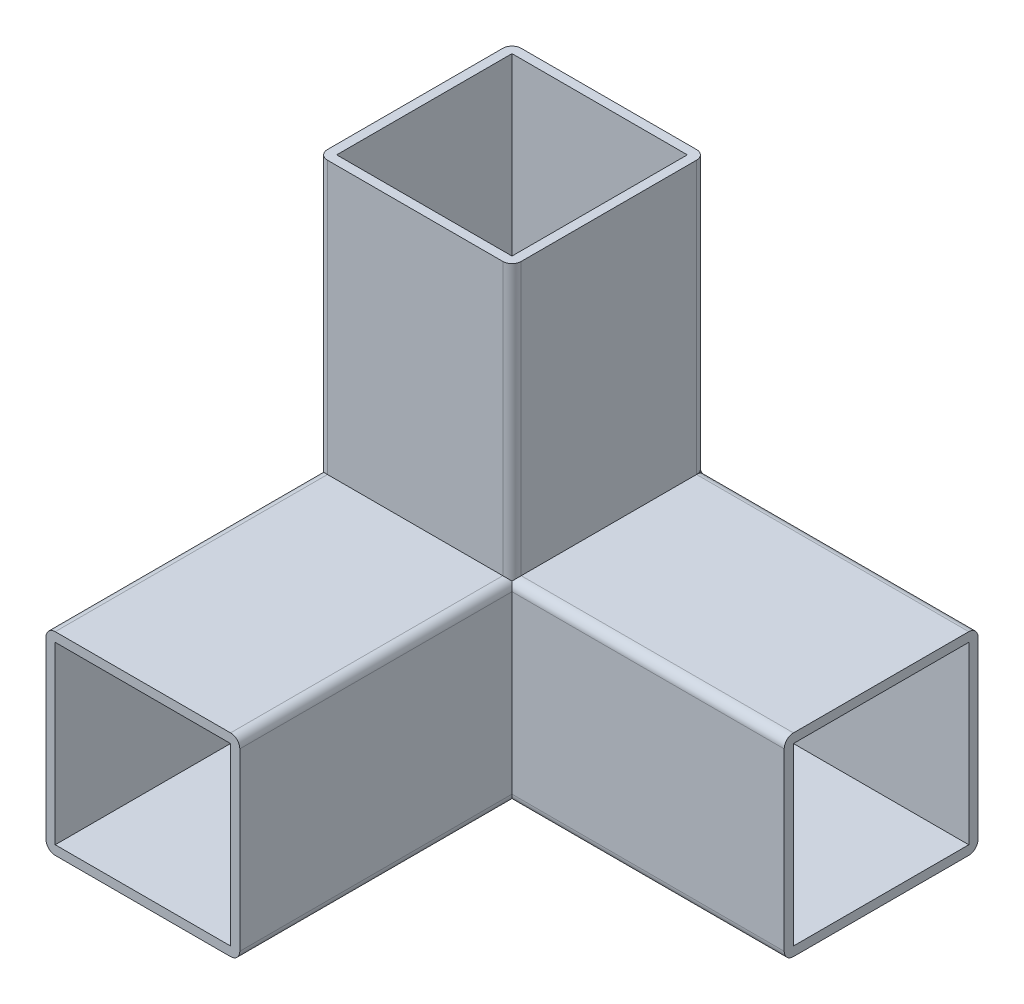
ISO-10303-21;
HEADER;
FILE_DESCRIPTION(('STEP AP214'),'2;1');
FILE_NAME('part.step','',(''),(''),'','','');
FILE_SCHEMA(('AUTOMOTIVE_DESIGN { 1 0 10303 214 1 1 1 1 }'));
ENDSEC;
DATA;
#1=APPLICATION_CONTEXT('core data for automotive mechanical design processes');
#2=APPLICATION_PROTOCOL_DEFINITION('international standard','automotive_design',2000,#1);
#3=PRODUCT_CONTEXT('',#1,'mechanical');
#4=PRODUCT('Part','Part','',(#3));
#5=PRODUCT_RELATED_PRODUCT_CATEGORY('part','',(#4));
#6=PRODUCT_DEFINITION_FORMATION('','',#4);
#7=PRODUCT_DEFINITION_CONTEXT('part definition',#1,'design');
#8=PRODUCT_DEFINITION('design','',#6,#7);
#9=PRODUCT_DEFINITION_SHAPE('','',#8);
#10=(LENGTH_UNIT() NAMED_UNIT(*) SI_UNIT(.MILLI.,.METRE.));
#11=(NAMED_UNIT(*) PLANE_ANGLE_UNIT() SI_UNIT($,.RADIAN.));
#12=(NAMED_UNIT(*) SI_UNIT($,.STERADIAN.) SOLID_ANGLE_UNIT());
#13=UNCERTAINTY_MEASURE_WITH_UNIT(LENGTH_MEASURE(1.E-05),#10,'distance_accuracy_value','');
#14=(GEOMETRIC_REPRESENTATION_CONTEXT(3) GLOBAL_UNCERTAINTY_ASSIGNED_CONTEXT((#13)) GLOBAL_UNIT_ASSIGNED_CONTEXT((#10,
#11,#12)) REPRESENTATION_CONTEXT('',''));
#15=CARTESIAN_POINT('',(0.,0.,0.));
#16=DIRECTION('',(0.,0.,1.));
#17=DIRECTION('',(1.,0.,0.));
#18=AXIS2_PLACEMENT_3D('',#15,#16,#17);
#19=CARTESIAN_POINT('',(-29.437,26.67,26.67));
#20=DIRECTION('',(0.,1.,0.));
#21=DIRECTION('',(0.,0.,1.));
#22=AXIS2_PLACEMENT_3D('',#19,#20,#21);
#23=PLANE('',#22);
#24=DIRECTION('',(-1.,0.,0.));
#25=VECTOR('',#24,1.);
#26=CARTESIAN_POINT('',(-26.67,26.67,26.67));
#27=LINE('',#26,#25);
#28=CARTESIAN_POINT('',(24.13,26.67,26.67));
#29=VERTEX_POINT('',#28);
#30=CARTESIAN_POINT('',(-24.13,26.67,26.67));
#31=VERTEX_POINT('',#30);
#32=EDGE_CURVE('E355',#29,#31,#27,.T.);
#33=ORIENTED_EDGE('',*,*,#32,.T.);
#34=DIRECTION('',(0.,0.,1.));
#35=VECTOR('',#34,1.);
#36=CARTESIAN_POINT('',(-24.13,26.67,26.67));
#37=LINE('',#36,#35);
#38=CARTESIAN_POINT('',(-24.13,26.67,101.6));
#39=VERTEX_POINT('',#38);
#40=EDGE_CURVE('E511',#31,#39,#37,.T.);
#41=ORIENTED_EDGE('',*,*,#40,.T.);
#42=DIRECTION('',(-1.,0.,0.));
#43=VECTOR('',#42,1.);
#44=CARTESIAN_POINT('',(-26.67,26.67,101.6));
#45=LINE('',#44,#43);
#46=CARTESIAN_POINT('',(24.13,26.67,101.6));
#47=VERTEX_POINT('',#46);
#48=EDGE_CURVE('E335',#47,#39,#45,.T.);
#49=ORIENTED_EDGE('',*,*,#48,.F.);
#50=DIRECTION('',(0.,0.,1.));
#51=VECTOR('',#50,1.);
#52=CARTESIAN_POINT('',(24.13,26.67,26.67));
#53=LINE('',#52,#51);
#54=EDGE_CURVE('E508',#47,#29,#53,.F.);
#55=ORIENTED_EDGE('',*,*,#54,.T.);
#56=EDGE_LOOP('',(#33,#41,#49,#55));
#57=FACE_BOUND('',#56,.T.);
#58=ADVANCED_FACE('F48',(#57),#23,.T.);
#59=CARTESIAN_POINT('',(101.6,0.,0.));
#60=DIRECTION('',(-1.,0.,0.));
#61=DIRECTION('',(0.,0.,1.));
#62=AXIS2_PLACEMENT_3D('',#59,#60,#61);
#63=PLANE('',#62);
#64=DIRECTION('',(0.,0.,1.));
#65=VECTOR('',#64,1.);
#66=CARTESIAN_POINT('',(101.6,26.67,26.67));
#67=LINE('',#66,#65);
#68=CARTESIAN_POINT('',(101.6,26.67,-24.13));
#69=VERTEX_POINT('',#68);
#70=CARTESIAN_POINT('',(101.6,26.67,24.13));
#71=VERTEX_POINT('',#70);
#72=EDGE_CURVE('E381',#69,#71,#67,.T.);
#73=ORIENTED_EDGE('',*,*,#72,.T.);
#74=CARTESIAN_POINT('',(101.6,24.13,24.13));
#75=DIRECTION('',(-1.,0.,0.));
#76=DIRECTION('',(0.,0.,1.));
#77=AXIS2_PLACEMENT_3D('',#74,#75,#76);
#78=CIRCLE('',#77,2.54);
#79=CARTESIAN_POINT('',(101.6,24.13,26.67));
#80=VERTEX_POINT('',#79);
#81=EDGE_CURVE('E72',#71,#80,#78,.F.);
#82=ORIENTED_EDGE('',*,*,#81,.T.);
#83=DIRECTION('',(0.,-1.,0.));
#84=VECTOR('',#83,1.);
#85=CARTESIAN_POINT('',(101.6,-26.67,26.67));
#86=LINE('',#85,#84);
#87=CARTESIAN_POINT('',(101.6,-24.13,26.67));
#88=VERTEX_POINT('',#87);
#89=EDGE_CURVE('E378',#80,#88,#86,.T.);
#90=ORIENTED_EDGE('',*,*,#89,.T.);
#91=CARTESIAN_POINT('',(101.6,-24.13,24.13));
#92=DIRECTION('',(-1.,0.,0.));
#93=DIRECTION('',(0.,0.,1.));
#94=AXIS2_PLACEMENT_3D('',#91,#92,#93);
#95=CIRCLE('',#94,2.54);
#96=CARTESIAN_POINT('',(101.6,-26.67,24.13));
#97=VERTEX_POINT('',#96);
#98=EDGE_CURVE('E434',#88,#97,#95,.F.);
#99=ORIENTED_EDGE('',*,*,#98,.T.);
#100=DIRECTION('',(0.,0.,-1.));
#101=VECTOR('',#100,1.);
#102=CARTESIAN_POINT('',(101.6,-26.67,26.67));
#103=LINE('',#102,#101);
#104=CARTESIAN_POINT('',(101.6,-26.67,-24.13));
#105=VERTEX_POINT('',#104);
#106=EDGE_CURVE('E350',#97,#105,#103,.T.);
#107=ORIENTED_EDGE('',*,*,#106,.T.);
#108=CARTESIAN_POINT('',(101.6,-24.13,-24.13));
#109=DIRECTION('',(-1.,0.,0.));
#110=DIRECTION('',(0.,0.,1.));
#111=AXIS2_PLACEMENT_3D('',#108,#109,#110);
#112=CIRCLE('',#111,2.54);
#113=CARTESIAN_POINT('',(101.6,-24.13,-26.67));
#114=VERTEX_POINT('',#113);
#115=EDGE_CURVE('E428',#105,#114,#112,.F.);
#116=ORIENTED_EDGE('',*,*,#115,.T.);
#117=DIRECTION('',(0.,1.,0.));
#118=VECTOR('',#117,1.);
#119=CARTESIAN_POINT('',(101.6,-26.67,-26.67));
#120=LINE('',#119,#118);
#121=CARTESIAN_POINT('',(101.6,24.13,-26.67));
#122=VERTEX_POINT('',#121);
#123=EDGE_CURVE('E362',#114,#122,#120,.T.);
#124=ORIENTED_EDGE('',*,*,#123,.T.);
#125=CARTESIAN_POINT('',(101.6,24.13,-24.13));
#126=DIRECTION('',(-1.,0.,0.));
#127=DIRECTION('',(0.,0.,1.));
#128=AXIS2_PLACEMENT_3D('',#125,#126,#127);
#129=CIRCLE('',#128,2.54);
#130=EDGE_CURVE('E431',#122,#69,#129,.F.);
#131=ORIENTED_EDGE('',*,*,#130,.T.);
#132=EDGE_LOOP('',(#73,#82,#90,#99,#107,#116,#124,#131));
#133=FACE_BOUND('',#132,.T.);
#134=DIRECTION('',(0.,1.,0.));
#135=VECTOR('',#134,1.);
#136=CARTESIAN_POINT('',(101.6,-26.67,-24.13));
#137=LINE('',#136,#135);
#138=CARTESIAN_POINT('',(101.6,-24.13,-24.13));
#139=VERTEX_POINT('',#138);
#140=CARTESIAN_POINT('',(101.6,24.13,-24.13));
#141=VERTEX_POINT('',#140);
#142=EDGE_CURVE('E269',#139,#141,#137,.T.);
#143=ORIENTED_EDGE('',*,*,#142,.F.);
#144=DIRECTION('',(0.,0.,-1.));
#145=VECTOR('',#144,1.);
#146=CARTESIAN_POINT('',(101.6,-24.13,26.67));
#147=LINE('',#146,#145);
#148=CARTESIAN_POINT('',(101.6,-24.13,24.13));
#149=VERTEX_POINT('',#148);
#150=EDGE_CURVE('E300',#149,#139,#147,.T.);
#151=ORIENTED_EDGE('',*,*,#150,.F.);
#152=DIRECTION('',(0.,-1.,0.));
#153=VECTOR('',#152,1.);
#154=CARTESIAN_POINT('',(101.6,-26.67,24.13));
#155=LINE('',#154,#153);
#156=CARTESIAN_POINT('',(101.6,24.13,24.13));
#157=VERTEX_POINT('',#156);
#158=EDGE_CURVE('E297',#157,#149,#155,.T.);
#159=ORIENTED_EDGE('',*,*,#158,.F.);
#160=DIRECTION('',(0.,0.,1.));
#161=VECTOR('',#160,1.);
#162=CARTESIAN_POINT('',(101.6,24.13,26.67));
#163=LINE('',#162,#161);
#164=EDGE_CURVE('E294',#141,#157,#163,.T.);
#165=ORIENTED_EDGE('',*,*,#164,.F.);
#166=EDGE_LOOP('',(#143,#151,#159,#165));
#167=FACE_BOUND('',#166,.T.);
#168=ADVANCED_FACE('F638',(#133,#167),#63,.F.);
#169=CARTESIAN_POINT('',(0.,101.6,0.));
#170=DIRECTION('',(0.,1.,0.));
#171=DIRECTION('',(0.,0.,1.));
#172=AXIS2_PLACEMENT_3D('',#169,#170,#171);
#173=PLANE('',#172);
#174=DIRECTION('',(1.,0.,0.));
#175=VECTOR('',#174,1.);
#176=CARTESIAN_POINT('',(-26.67,101.6,-26.67));
#177=LINE('',#176,#175);
#178=CARTESIAN_POINT('',(-24.13,101.6,-26.67));
#179=VERTEX_POINT('',#178);
#180=CARTESIAN_POINT('',(24.13,101.6,-26.67));
#181=VERTEX_POINT('',#180);
#182=EDGE_CURVE('E357',#179,#181,#177,.T.);
#183=ORIENTED_EDGE('',*,*,#182,.F.);
#184=CARTESIAN_POINT('',(-24.13,101.6,-24.13));
#185=DIRECTION('',(0.,1.,0.));
#186=DIRECTION('',(-1.,0.,0.));
#187=AXIS2_PLACEMENT_3D('',#184,#185,#186);
#188=CIRCLE('',#187,2.54);
#189=CARTESIAN_POINT('',(-26.67,101.6,-24.13));
#190=VERTEX_POINT('',#189);
#191=EDGE_CURVE('E498',#179,#190,#188,.T.);
#192=ORIENTED_EDGE('',*,*,#191,.T.);
#193=DIRECTION('',(0.,0.,-1.));
#194=VECTOR('',#193,1.);
#195=CARTESIAN_POINT('',(-26.67,101.6,26.67));
#196=LINE('',#195,#194);
#197=CARTESIAN_POINT('',(-26.67,101.6,24.13));
#198=VERTEX_POINT('',#197);
#199=EDGE_CURVE('E369',#198,#190,#196,.T.);
#200=ORIENTED_EDGE('',*,*,#199,.F.);
#201=CARTESIAN_POINT('',(-24.13,101.6,24.13));
#202=DIRECTION('',(0.,1.,0.));
#203=DIRECTION('',(-1.,0.,0.));
#204=AXIS2_PLACEMENT_3D('',#201,#202,#203);
#205=CIRCLE('',#204,2.54);
#206=CARTESIAN_POINT('',(-24.13,101.6,26.67));
#207=VERTEX_POINT('',#206);
#208=EDGE_CURVE('E492',#198,#207,#205,.T.);
#209=ORIENTED_EDGE('',*,*,#208,.T.);
#210=DIRECTION('',(-1.,0.,0.));
#211=VECTOR('',#210,1.);
#212=CARTESIAN_POINT('',(-26.67,101.6,26.67));
#213=LINE('',#212,#211);
#214=CARTESIAN_POINT('',(24.13,101.6,26.67));
#215=VERTEX_POINT('',#214);
#216=EDGE_CURVE('E365',#215,#207,#213,.T.);
#217=ORIENTED_EDGE('',*,*,#216,.F.);
#218=CARTESIAN_POINT('',(24.13,101.6,24.13));
#219=DIRECTION('',(0.,1.,0.));
#220=DIRECTION('',(-1.,0.,0.));
#221=AXIS2_PLACEMENT_3D('',#218,#219,#220);
#222=CIRCLE('',#221,2.54);
#223=CARTESIAN_POINT('',(26.67,101.6,24.13));
#224=VERTEX_POINT('',#223);
#225=EDGE_CURVE('E397',#215,#224,#222,.T.);
#226=ORIENTED_EDGE('',*,*,#225,.T.);
#227=DIRECTION('',(0.,0.,1.));
#228=VECTOR('',#227,1.);
#229=CARTESIAN_POINT('',(26.67,101.6,26.67));
#230=LINE('',#229,#228);
#231=CARTESIAN_POINT('',(26.67,101.6,-24.13));
#232=VERTEX_POINT('',#231);
#233=EDGE_CURVE('E361',#232,#224,#230,.T.);
#234=ORIENTED_EDGE('',*,*,#233,.F.);
#235=CARTESIAN_POINT('',(24.13,101.6,-24.13));
#236=DIRECTION('',(0.,1.,0.));
#237=DIRECTION('',(-1.,0.,0.));
#238=AXIS2_PLACEMENT_3D('',#235,#236,#237);
#239=CIRCLE('',#238,2.54);
#240=EDGE_CURVE('E495',#232,#181,#239,.T.);
#241=ORIENTED_EDGE('',*,*,#240,.T.);
#242=EDGE_LOOP('',(#183,#192,#200,#209,#217,#226,#234,#241));
#243=FACE_BOUND('',#242,.T.);
#244=DIRECTION('',(0.,0.,-1.));
#245=VECTOR('',#244,1.);
#246=CARTESIAN_POINT('',(-24.13,101.6,26.67));
#247=LINE('',#246,#245);
#248=CARTESIAN_POINT('',(-24.13,101.6,24.13));
#249=VERTEX_POINT('',#248);
#250=CARTESIAN_POINT('',(-24.13,101.6,-24.13));
#251=VERTEX_POINT('',#250);
#252=EDGE_CURVE('E282',#249,#251,#247,.T.);
#253=ORIENTED_EDGE('',*,*,#252,.T.);
#254=DIRECTION('',(1.,0.,0.));
#255=VECTOR('',#254,1.);
#256=CARTESIAN_POINT('',(-26.67,101.6,-24.13));
#257=LINE('',#256,#255);
#258=CARTESIAN_POINT('',(24.13,101.6,-24.13));
#259=VERTEX_POINT('',#258);
#260=EDGE_CURVE('E328',#251,#259,#257,.T.);
#261=ORIENTED_EDGE('',*,*,#260,.T.);
#262=DIRECTION('',(0.,0.,1.));
#263=VECTOR('',#262,1.);
#264=CARTESIAN_POINT('',(24.13,101.6,26.67));
#265=LINE('',#264,#263);
#266=CARTESIAN_POINT('',(24.13,101.6,24.13));
#267=VERTEX_POINT('',#266);
#268=EDGE_CURVE('E275',#259,#267,#265,.T.);
#269=ORIENTED_EDGE('',*,*,#268,.T.);
#270=DIRECTION('',(-1.,0.,0.));
#271=VECTOR('',#270,1.);
#272=CARTESIAN_POINT('',(-26.67,101.6,24.13));
#273=LINE('',#272,#271);
#274=EDGE_CURVE('E322',#267,#249,#273,.T.);
#275=ORIENTED_EDGE('',*,*,#274,.T.);
#276=EDGE_LOOP('',(#253,#261,#269,#275));
#277=FACE_BOUND('',#276,.T.);
#278=ADVANCED_FACE('F598',(#243,#277),#173,.T.);
#279=CARTESIAN_POINT('',(0.,0.,101.6));
#280=DIRECTION('',(0.,0.,-1.));
#281=DIRECTION('',(-1.,0.,0.));
#282=AXIS2_PLACEMENT_3D('',#279,#280,#281);
#283=PLANE('',#282);
#284=ORIENTED_EDGE('',*,*,#48,.T.);
#285=CARTESIAN_POINT('',(-24.13,24.13,101.6));
#286=DIRECTION('',(0.,0.,-1.));
#287=DIRECTION('',(-1.,0.,0.));
#288=AXIS2_PLACEMENT_3D('',#285,#286,#287);
#289=CIRCLE('',#288,2.54);
#290=CARTESIAN_POINT('',(-26.67,24.13,101.6));
#291=VERTEX_POINT('',#290);
#292=EDGE_CURVE('E517',#39,#291,#289,.F.);
#293=ORIENTED_EDGE('',*,*,#292,.T.);
#294=DIRECTION('',(0.,-1.,0.));
#295=VECTOR('',#294,1.);
#296=CARTESIAN_POINT('',(-26.67,-26.67,101.6));
#297=LINE('',#296,#295);
#298=CARTESIAN_POINT('',(-26.67,-24.13,101.6));
#299=VERTEX_POINT('',#298);
#300=EDGE_CURVE('E339',#291,#299,#297,.T.);
#301=ORIENTED_EDGE('',*,*,#300,.T.);
#302=CARTESIAN_POINT('',(-24.13,-24.13,101.6));
#303=DIRECTION('',(0.,0.,-1.));
#304=DIRECTION('',(-1.,0.,0.));
#305=AXIS2_PLACEMENT_3D('',#302,#303,#304);
#306=CIRCLE('',#305,2.54);
#307=CARTESIAN_POINT('',(-24.13,-26.67,101.6));
#308=VERTEX_POINT('',#307);
#309=EDGE_CURVE('E415',#299,#308,#306,.F.);
#310=ORIENTED_EDGE('',*,*,#309,.T.);
#311=DIRECTION('',(1.,0.,0.));
#312=VECTOR('',#311,1.);
#313=CARTESIAN_POINT('',(-26.67,-26.67,101.6));
#314=LINE('',#313,#312);
#315=CARTESIAN_POINT('',(24.13,-26.67,101.6));
#316=VERTEX_POINT('',#315);
#317=EDGE_CURVE('E342',#308,#316,#314,.T.);
#318=ORIENTED_EDGE('',*,*,#317,.T.);
#319=CARTESIAN_POINT('',(24.13,-24.13,101.6));
#320=DIRECTION('',(0.,0.,-1.));
#321=DIRECTION('',(-1.,0.,0.));
#322=AXIS2_PLACEMENT_3D('',#319,#320,#321);
#323=CIRCLE('',#322,2.54);
#324=CARTESIAN_POINT('',(26.67,-24.13,101.6));
#325=VERTEX_POINT('',#324);
#326=EDGE_CURVE('E418',#316,#325,#323,.F.);
#327=ORIENTED_EDGE('',*,*,#326,.T.);
#328=DIRECTION('',(0.,1.,0.));
#329=VECTOR('',#328,1.);
#330=CARTESIAN_POINT('',(26.67,-26.67,101.6));
#331=LINE('',#330,#329);
#332=CARTESIAN_POINT('',(26.67,24.13,101.6));
#333=VERTEX_POINT('',#332);
#334=EDGE_CURVE('E331',#325,#333,#331,.T.);
#335=ORIENTED_EDGE('',*,*,#334,.T.);
#336=CARTESIAN_POINT('',(24.13,24.13,101.6));
#337=DIRECTION('',(0.,0.,-1.));
#338=DIRECTION('',(-1.,0.,0.));
#339=AXIS2_PLACEMENT_3D('',#336,#337,#338);
#340=CIRCLE('',#339,2.54);
#341=EDGE_CURVE('E514',#333,#47,#340,.F.);
#342=ORIENTED_EDGE('',*,*,#341,.T.);
#343=EDGE_LOOP('',(#284,#293,#301,#310,#318,#327,#335,#342));
#344=FACE_BOUND('',#343,.T.);
#345=DIRECTION('',(0.,1.,0.));
#346=VECTOR('',#345,1.);
#347=CARTESIAN_POINT('',(24.13,-26.67,101.6));
#348=LINE('',#347,#346);
#349=CARTESIAN_POINT('',(24.13,-24.13,101.6));
#350=VERTEX_POINT('',#349);
#351=CARTESIAN_POINT('',(24.13,24.13,101.6));
#352=VERTEX_POINT('',#351);
#353=EDGE_CURVE('E290',#350,#352,#348,.T.);
#354=ORIENTED_EDGE('',*,*,#353,.F.);
#355=DIRECTION('',(1.,0.,0.));
#356=VECTOR('',#355,1.);
#357=CARTESIAN_POINT('',(-29.437,-24.13,101.6));
#358=LINE('',#357,#356);
#359=CARTESIAN_POINT('',(-24.13,-24.13,101.6));
#360=VERTEX_POINT('',#359);
#361=EDGE_CURVE('E304',#360,#350,#358,.T.);
#362=ORIENTED_EDGE('',*,*,#361,.F.);
#363=DIRECTION('',(0.,-1.,0.));
#364=VECTOR('',#363,1.);
#365=CARTESIAN_POINT('',(-24.13,101.6,101.6));
#366=LINE('',#365,#364);
#367=CARTESIAN_POINT('',(-24.13,24.13,101.6));
#368=VERTEX_POINT('',#367);
#369=EDGE_CURVE('E308',#368,#360,#366,.T.);
#370=ORIENTED_EDGE('',*,*,#369,.F.);
#371=DIRECTION('',(-1.,0.,0.));
#372=VECTOR('',#371,1.);
#373=CARTESIAN_POINT('',(-26.67,24.13,101.6));
#374=LINE('',#373,#372);
#375=EDGE_CURVE('E289',#352,#368,#374,.T.);
#376=ORIENTED_EDGE('',*,*,#375,.F.);
#377=EDGE_LOOP('',(#354,#362,#370,#376));
#378=FACE_BOUND('',#377,.T.);
#379=ADVANCED_FACE('F616',(#344,#378),#283,.F.);
#380=CARTESIAN_POINT('',(-29.437,-26.67,-26.67));
#381=DIRECTION('',(0.,0.,-1.));
#382=DIRECTION('',(-1.,0.,0.));
#383=AXIS2_PLACEMENT_3D('',#380,#381,#382);
#384=PLANE('',#383);
#385=DIRECTION('',(-0.707106781186548,-0.707106781186548,0.));
#386=VECTOR('',#385,1.);
#387=CARTESIAN_POINT('',(37.465,37.465,-26.67));
#388=LINE('',#387,#386);
#389=CARTESIAN_POINT('',(24.8739487757862,24.8739487757862,-26.67));
#390=VERTEX_POINT('',#389);
#391=CARTESIAN_POINT('',(-24.13,-24.13,-26.67));
#392=VERTEX_POINT('',#391);
#393=EDGE_CURVE('E356',#390,#392,#388,.T.);
#394=ORIENTED_EDGE('',*,*,#393,.F.);
#395=CARTESIAN_POINT('',(26.67,26.67,-26.67));
#396=DIRECTION('',(0.,0.,-1.));
#397=DIRECTION('',(-1.,0.,0.));
#398=AXIS2_PLACEMENT_3D('',#395,#396,#397);
#399=CIRCLE('',#398,2.54);
#400=CARTESIAN_POINT('',(26.67,24.13,-26.67));
#401=VERTEX_POINT('',#400);
#402=EDGE_CURVE('E467',#390,#401,#399,.F.);
#403=ORIENTED_EDGE('',*,*,#402,.T.);
#404=DIRECTION('',(1.,0.,0.));
#405=VECTOR('',#404,1.);
#406=CARTESIAN_POINT('',(-29.437,24.13,-26.67));
#407=LINE('',#406,#405);
#408=EDGE_CURVE('E445',#401,#122,#407,.T.);
#409=ORIENTED_EDGE('',*,*,#408,.T.);
#410=ORIENTED_EDGE('',*,*,#123,.F.);
#411=DIRECTION('',(1.,0.,0.));
#412=VECTOR('',#411,1.);
#413=CARTESIAN_POINT('',(-29.437,-24.13,-26.67));
#414=LINE('',#413,#412);
#415=EDGE_CURVE('E441',#114,#392,#414,.F.);
#416=ORIENTED_EDGE('',*,*,#415,.T.);
#417=EDGE_LOOP('',(#394,#403,#409,#410,#416));
#418=FACE_BOUND('',#417,.T.);
#419=ADVANCED_FACE('F588',(#418),#384,.T.);
#420=DIRECTION('',(0.,0.,-1.));
#421=VECTOR('',#420,1.);
#422=CARTESIAN_POINT('',(26.67,26.67,26.67));
#423=LINE('',#422,#421);
#424=CARTESIAN_POINT('',(26.67,26.67,24.13));
#425=VERTEX_POINT('',#424);
#426=CARTESIAN_POINT('',(26.67,26.67,-24.13));
#427=VERTEX_POINT('',#426);
#428=EDGE_CURVE('E351',#425,#427,#423,.T.);
#429=ORIENTED_EDGE('',*,*,#428,.F.);
#430=DIRECTION('',(1.,0.,0.));
#431=VECTOR('',#430,1.);
#432=CARTESIAN_POINT('',(-29.437,26.67,24.13));
#433=LINE('',#432,#431);
#434=EDGE_CURVE('E505',#425,#71,#433,.T.);
#435=ORIENTED_EDGE('',*,*,#434,.T.);
#436=ORIENTED_EDGE('',*,*,#72,.F.);
#437=DIRECTION('',(1.,0.,0.));
#438=VECTOR('',#437,1.);
#439=CARTESIAN_POINT('',(-29.437,26.67,-24.13));
#440=LINE('',#439,#438);
#441=EDGE_CURVE('E449',#69,#427,#440,.F.);
#442=ORIENTED_EDGE('',*,*,#441,.T.);
#443=EDGE_LOOP('',(#429,#435,#436,#442));
#444=FACE_BOUND('',#443,.T.);
#445=ADVANCED_FACE('F567',(#444),#23,.T.);
#446=CARTESIAN_POINT('',(-29.437,-26.67,26.67));
#447=DIRECTION('',(0.,0.,1.));
#448=DIRECTION('',(1.,0.,0.));
#449=AXIS2_PLACEMENT_3D('',#446,#447,#448);
#450=PLANE('',#449);
#451=ORIENTED_EDGE('',*,*,#89,.F.);
#452=DIRECTION('',(1.,0.,0.));
#453=VECTOR('',#452,1.);
#454=CARTESIAN_POINT('',(-29.437,24.13,26.67));
#455=LINE('',#454,#453);
#456=CARTESIAN_POINT('',(26.67,24.13,26.67));
#457=VERTEX_POINT('',#456);
#458=EDGE_CURVE('E526',#80,#457,#455,.F.);
#459=ORIENTED_EDGE('',*,*,#458,.T.);
#460=DIRECTION('',(0.,1.,0.));
#461=VECTOR('',#460,1.);
#462=CARTESIAN_POINT('',(26.67,-26.67,26.67));
#463=LINE('',#462,#461);
#464=CARTESIAN_POINT('',(26.67,-24.13,26.67));
#465=VERTEX_POINT('',#464);
#466=EDGE_CURVE('E346',#465,#457,#463,.T.);
#467=ORIENTED_EDGE('',*,*,#466,.F.);
#468=DIRECTION('',(1.,0.,0.));
#469=VECTOR('',#468,1.);
#470=CARTESIAN_POINT('',(-29.437,-24.13,26.67));
#471=LINE('',#470,#469);
#472=EDGE_CURVE('E424',#465,#88,#471,.T.);
#473=ORIENTED_EDGE('',*,*,#472,.T.);
#474=EDGE_LOOP('',(#451,#459,#467,#473));
#475=FACE_BOUND('',#474,.T.);
#476=ADVANCED_FACE('F634',(#475),#450,.T.);
#477=CARTESIAN_POINT('',(-29.437,-26.67,26.67));
#478=DIRECTION('',(0.,-1.,0.));
#479=DIRECTION('',(0.,0.,-1.));
#480=AXIS2_PLACEMENT_3D('',#477,#478,#479);
#481=PLANE('',#480);
#482=DIRECTION('',(1.,0.,0.));
#483=VECTOR('',#482,1.);
#484=CARTESIAN_POINT('',(-29.437,-26.67,24.13));
#485=LINE('',#484,#483);
#486=CARTESIAN_POINT('',(24.13,-26.67,24.13));
#487=VERTEX_POINT('',#486);
#488=EDGE_CURVE('E408',#97,#487,#485,.F.);
#489=ORIENTED_EDGE('',*,*,#488,.T.);
#490=DIRECTION('',(0.,0.,1.));
#491=VECTOR('',#490,1.);
#492=CARTESIAN_POINT('',(24.13,-26.67,26.67));
#493=LINE('',#492,#491);
#494=EDGE_CURVE('E411',#487,#316,#493,.T.);
#495=ORIENTED_EDGE('',*,*,#494,.T.);
#496=ORIENTED_EDGE('',*,*,#317,.F.);
#497=DIRECTION('',(0.,0.,1.));
#498=VECTOR('',#497,1.);
#499=CARTESIAN_POINT('',(-24.13,-26.67,26.67));
#500=LINE('',#499,#498);
#501=CARTESIAN_POINT('',(-24.13,-26.67,-24.13));
#502=VERTEX_POINT('',#501);
#503=EDGE_CURVE('E404',#308,#502,#500,.F.);
#504=ORIENTED_EDGE('',*,*,#503,.T.);
#505=DIRECTION('',(1.,0.,0.));
#506=VECTOR('',#505,1.);
#507=CARTESIAN_POINT('',(-29.437,-26.67,-24.13));
#508=LINE('',#507,#506);
#509=EDGE_CURVE('E401',#502,#105,#508,.T.);
#510=ORIENTED_EDGE('',*,*,#509,.T.);
#511=ORIENTED_EDGE('',*,*,#106,.F.);
#512=EDGE_LOOP('',(#489,#495,#496,#504,#510,#511));
#513=FACE_BOUND('',#512,.T.);
#514=ADVANCED_FACE('F619',(#513),#481,.T.);
#515=CARTESIAN_POINT('',(-26.67,101.6,26.67));
#516=DIRECTION('',(-1.,0.,0.));
#517=DIRECTION('',(0.,0.,1.));
#518=AXIS2_PLACEMENT_3D('',#515,#516,#517);
#519=PLANE('',#518);
#520=ORIENTED_EDGE('',*,*,#199,.T.);
#521=DIRECTION('',(0.,-1.,0.));
#522=VECTOR('',#521,1.);
#523=CARTESIAN_POINT('',(-26.67,101.6,-24.13));
#524=LINE('',#523,#522);
#525=CARTESIAN_POINT('',(-26.67,-24.13,-24.13));
#526=VERTEX_POINT('',#525);
#527=EDGE_CURVE('E480',#190,#526,#524,.T.);
#528=ORIENTED_EDGE('',*,*,#527,.T.);
#529=DIRECTION('',(0.,0.,1.));
#530=VECTOR('',#529,1.);
#531=CARTESIAN_POINT('',(-26.67,-24.13,26.67));
#532=LINE('',#531,#530);
#533=EDGE_CURVE('E437',#526,#299,#532,.T.);
#534=ORIENTED_EDGE('',*,*,#533,.T.);
#535=ORIENTED_EDGE('',*,*,#300,.F.);
#536=DIRECTION('',(0.,0.,1.));
#537=VECTOR('',#536,1.);
#538=CARTESIAN_POINT('',(-26.67,24.13,26.67));
#539=LINE('',#538,#537);
#540=CARTESIAN_POINT('',(-26.67,24.13,24.13));
#541=VERTEX_POINT('',#540);
#542=EDGE_CURVE('E474',#291,#541,#539,.F.);
#543=ORIENTED_EDGE('',*,*,#542,.T.);
#544=DIRECTION('',(0.,-1.,0.));
#545=VECTOR('',#544,1.);
#546=CARTESIAN_POINT('',(-26.67,101.6,24.13));
#547=LINE('',#546,#545);
#548=EDGE_CURVE('E477',#541,#198,#547,.F.);
#549=ORIENTED_EDGE('',*,*,#548,.T.);
#550=EDGE_LOOP('',(#520,#528,#534,#535,#543,#549));
#551=FACE_BOUND('',#550,.T.);
#552=ADVANCED_FACE('F608',(#551),#519,.T.);
#553=CARTESIAN_POINT('',(-26.67,101.6,26.67));
#554=DIRECTION('',(0.,0.,1.));
#555=DIRECTION('',(1.,0.,0.));
#556=AXIS2_PLACEMENT_3D('',#553,#554,#555);
#557=PLANE('',#556);
#558=ORIENTED_EDGE('',*,*,#216,.T.);
#559=DIRECTION('',(0.,-1.,0.));
#560=VECTOR('',#559,1.);
#561=CARTESIAN_POINT('',(-24.13,101.6,26.67));
#562=LINE('',#561,#560);
#563=EDGE_CURVE('E501',#207,#31,#562,.T.);
#564=ORIENTED_EDGE('',*,*,#563,.T.);
#565=ORIENTED_EDGE('',*,*,#32,.F.);
#566=DIRECTION('',(0.,-1.,0.));
#567=VECTOR('',#566,1.);
#568=CARTESIAN_POINT('',(24.13,101.6,26.67));
#569=LINE('',#568,#567);
#570=EDGE_CURVE('E394',#29,#215,#569,.F.);
#571=ORIENTED_EDGE('',*,*,#570,.T.);
#572=EDGE_LOOP('',(#558,#564,#565,#571));
#573=FACE_BOUND('',#572,.T.);
#574=ADVANCED_FACE('F911',(#573),#557,.T.);
#575=CARTESIAN_POINT('',(26.67,101.6,26.67));
#576=DIRECTION('',(1.,0.,0.));
#577=DIRECTION('',(0.,0.,-1.));
#578=AXIS2_PLACEMENT_3D('',#575,#576,#577);
#579=PLANE('',#578);
#580=ORIENTED_EDGE('',*,*,#428,.T.);
#581=DIRECTION('',(0.,-1.,0.));
#582=VECTOR('',#581,1.);
#583=CARTESIAN_POINT('',(26.67,101.6,-24.13));
#584=LINE('',#583,#582);
#585=EDGE_CURVE('E471',#427,#232,#584,.F.);
#586=ORIENTED_EDGE('',*,*,#585,.T.);
#587=ORIENTED_EDGE('',*,*,#233,.T.);
#588=DIRECTION('',(0.,-1.,0.));
#589=VECTOR('',#588,1.);
#590=CARTESIAN_POINT('',(26.67,101.6,24.13));
#591=LINE('',#590,#589);
#592=EDGE_CURVE('E390',#224,#425,#591,.T.);
#593=ORIENTED_EDGE('',*,*,#592,.T.);
#594=EDGE_LOOP('',(#580,#586,#587,#593));
#595=FACE_BOUND('',#594,.T.);
#596=ADVANCED_FACE('F563',(#595),#579,.T.);
#597=CARTESIAN_POINT('',(-26.67,101.6,-26.67));
#598=DIRECTION('',(0.,0.,-1.));
#599=DIRECTION('',(-1.,0.,0.));
#600=AXIS2_PLACEMENT_3D('',#597,#598,#599);
#601=PLANE('',#600);
#602=ORIENTED_EDGE('',*,*,#393,.T.);
#603=DIRECTION('',(0.,-1.,0.));
#604=VECTOR('',#603,1.);
#605=CARTESIAN_POINT('',(-24.13,101.6,-26.67));
#606=LINE('',#605,#604);
#607=EDGE_CURVE('E489',#392,#179,#606,.F.);
#608=ORIENTED_EDGE('',*,*,#607,.T.);
#609=ORIENTED_EDGE('',*,*,#182,.T.);
#610=DIRECTION('',(0.,-1.,0.));
#611=VECTOR('',#610,1.);
#612=CARTESIAN_POINT('',(24.13,101.6,-26.67));
#613=LINE('',#612,#611);
#614=CARTESIAN_POINT('',(24.13,26.67,-26.67));
#615=VERTEX_POINT('',#614);
#616=EDGE_CURVE('E486',#181,#615,#613,.T.);
#617=ORIENTED_EDGE('',*,*,#616,.T.);
#618=CARTESIAN_POINT('',(26.67,26.67,-26.67));
#619=DIRECTION('',(0.,0.,-1.));
#620=DIRECTION('',(-1.,0.,0.));
#621=AXIS2_PLACEMENT_3D('',#618,#619,#620);
#622=CIRCLE('',#621,2.54);
#623=EDGE_CURVE('E483',#615,#390,#622,.F.);
#624=ORIENTED_EDGE('',*,*,#623,.T.);
#625=EDGE_LOOP('',(#602,#608,#609,#617,#624));
#626=FACE_BOUND('',#625,.T.);
#627=ADVANCED_FACE('F593',(#626),#601,.T.);
#628=CARTESIAN_POINT('',(26.67,-26.67,0.));
#629=DIRECTION('',(1.,0.,0.));
#630=DIRECTION('',(0.,0.,-1.));
#631=AXIS2_PLACEMENT_3D('',#628,#629,#630);
#632=PLANE('',#631);
#633=ORIENTED_EDGE('',*,*,#466,.T.);
#634=DIRECTION('',(0.,0.,1.));
#635=VECTOR('',#634,1.);
#636=CARTESIAN_POINT('',(26.67,24.13,0.));
#637=LINE('',#636,#635);
#638=EDGE_CURVE('E520',#457,#333,#637,.T.);
#639=ORIENTED_EDGE('',*,*,#638,.T.);
#640=ORIENTED_EDGE('',*,*,#334,.F.);
#641=DIRECTION('',(0.,0.,1.));
#642=VECTOR('',#641,1.);
#643=CARTESIAN_POINT('',(26.67,-24.13,0.));
#644=LINE('',#643,#642);
#645=EDGE_CURVE('E421',#325,#465,#644,.F.);
#646=ORIENTED_EDGE('',*,*,#645,.T.);
#647=EDGE_LOOP('',(#633,#639,#640,#646));
#648=FACE_BOUND('',#647,.T.);
#649=ADVANCED_FACE('F630',(#648),#632,.T.);
#650=CARTESIAN_POINT('',(-29.437,-26.67,-24.13));
#651=DIRECTION('',(0.,0.,-1.));
#652=DIRECTION('',(-1.,0.,0.));
#653=AXIS2_PLACEMENT_3D('',#650,#651,#652);
#654=PLANE('',#653);
#655=DIRECTION('',(-0.707106781186548,-0.707106781186548,0.));
#656=VECTOR('',#655,1.);
#657=CARTESIAN_POINT('',(37.465,37.465,-24.13));
#658=LINE('',#657,#656);
#659=CARTESIAN_POINT('',(24.13,24.13,-24.13));
#660=VERTEX_POINT('',#659);
#661=CARTESIAN_POINT('',(-24.13,-24.13,-24.13));
#662=VERTEX_POINT('',#661);
#663=EDGE_CURVE('E256',#660,#662,#658,.T.);
#664=ORIENTED_EDGE('',*,*,#663,.T.);
#665=DIRECTION('',(1.,0.,0.));
#666=VECTOR('',#665,1.);
#667=CARTESIAN_POINT('',(-29.437,-24.13,-24.13));
#668=LINE('',#667,#666);
#669=EDGE_CURVE('E271',#662,#139,#668,.T.);
#670=ORIENTED_EDGE('',*,*,#669,.T.);
#671=ORIENTED_EDGE('',*,*,#142,.T.);
#672=DIRECTION('',(1.,0.,0.));
#673=VECTOR('',#672,1.);
#674=CARTESIAN_POINT('',(-29.437,24.13,-24.13));
#675=LINE('',#674,#673);
#676=EDGE_CURVE('E241',#660,#141,#675,.T.);
#677=ORIENTED_EDGE('',*,*,#676,.F.);
#678=EDGE_LOOP('',(#664,#670,#671,#677));
#679=FACE_BOUND('',#678,.T.);
#680=ADVANCED_FACE('F267',(#679),#654,.F.);
#681=CARTESIAN_POINT('',(-29.437,24.13,26.67));
#682=DIRECTION('',(0.,1.,0.));
#683=DIRECTION('',(0.,0.,1.));
#684=AXIS2_PLACEMENT_3D('',#681,#682,#683);
#685=PLANE('',#684);
#686=DIRECTION('',(0.,0.,-1.));
#687=VECTOR('',#686,1.);
#688=CARTESIAN_POINT('',(24.13,24.13,26.67));
#689=LINE('',#688,#687);
#690=CARTESIAN_POINT('',(24.13,24.13,24.13));
#691=VERTEX_POINT('',#690);
#692=EDGE_CURVE('E237',#691,#660,#689,.T.);
#693=ORIENTED_EDGE('',*,*,#692,.T.);
#694=ORIENTED_EDGE('',*,*,#676,.T.);
#695=ORIENTED_EDGE('',*,*,#164,.T.);
#696=DIRECTION('',(1.,0.,0.));
#697=VECTOR('',#696,1.);
#698=CARTESIAN_POINT('',(-29.437,24.13,24.13));
#699=LINE('',#698,#697);
#700=EDGE_CURVE('E244',#691,#157,#699,.T.);
#701=ORIENTED_EDGE('',*,*,#700,.F.);
#702=EDGE_LOOP('',(#693,#694,#695,#701));
#703=FACE_BOUND('',#702,.T.);
#704=ADVANCED_FACE('F239',(#703),#685,.F.);
#705=CARTESIAN_POINT('',(-29.437,-26.67,24.13));
#706=DIRECTION('',(0.,0.,1.));
#707=DIRECTION('',(1.,0.,0.));
#708=AXIS2_PLACEMENT_3D('',#705,#706,#707);
#709=PLANE('',#708);
#710=DIRECTION('',(0.,1.,0.));
#711=VECTOR('',#710,1.);
#712=CARTESIAN_POINT('',(24.13,-26.67,24.13));
#713=LINE('',#712,#711);
#714=CARTESIAN_POINT('',(24.13,-24.13,24.13));
#715=VERTEX_POINT('',#714);
#716=EDGE_CURVE('E303',#715,#691,#713,.T.);
#717=ORIENTED_EDGE('',*,*,#716,.T.);
#718=ORIENTED_EDGE('',*,*,#700,.T.);
#719=ORIENTED_EDGE('',*,*,#158,.T.);
#720=DIRECTION('',(1.,0.,0.));
#721=VECTOR('',#720,1.);
#722=CARTESIAN_POINT('',(-29.437,-24.13,24.13));
#723=LINE('',#722,#721);
#724=EDGE_CURVE('E293',#715,#149,#723,.T.);
#725=ORIENTED_EDGE('',*,*,#724,.F.);
#726=EDGE_LOOP('',(#717,#718,#719,#725));
#727=FACE_BOUND('',#726,.T.);
#728=ADVANCED_FACE('F734',(#727),#709,.F.);
#729=CARTESIAN_POINT('',(-29.437,-24.13,26.67));
#730=DIRECTION('',(0.,-1.,0.));
#731=DIRECTION('',(0.,0.,-1.));
#732=AXIS2_PLACEMENT_3D('',#729,#730,#731);
#733=PLANE('',#732);
#734=ORIENTED_EDGE('',*,*,#361,.T.);
#735=DIRECTION('',(0.,0.,1.));
#736=VECTOR('',#735,1.);
#737=CARTESIAN_POINT('',(24.13,-24.13,26.67));
#738=LINE('',#737,#736);
#739=EDGE_CURVE('E312',#715,#350,#738,.T.);
#740=ORIENTED_EDGE('',*,*,#739,.F.);
#741=ORIENTED_EDGE('',*,*,#724,.T.);
#742=ORIENTED_EDGE('',*,*,#150,.T.);
#743=ORIENTED_EDGE('',*,*,#669,.F.);
#744=DIRECTION('',(0.,0.,1.));
#745=VECTOR('',#744,1.);
#746=CARTESIAN_POINT('',(-24.13,-24.13,26.67));
#747=LINE('',#746,#745);
#748=EDGE_CURVE('E250',#662,#360,#747,.T.);
#749=ORIENTED_EDGE('',*,*,#748,.T.);
#750=EDGE_LOOP('',(#734,#740,#741,#742,#743,#749));
#751=FACE_BOUND('',#750,.T.);
#752=ADVANCED_FACE('F716',(#751),#733,.F.);
#753=CARTESIAN_POINT('',(-24.13,101.6,26.67));
#754=DIRECTION('',(-1.,0.,0.));
#755=DIRECTION('',(0.,0.,1.));
#756=AXIS2_PLACEMENT_3D('',#753,#754,#755);
#757=PLANE('',#756);
#758=ORIENTED_EDGE('',*,*,#748,.F.);
#759=DIRECTION('',(0.,-1.,0.));
#760=VECTOR('',#759,1.);
#761=CARTESIAN_POINT('',(-24.13,101.6,-24.13));
#762=LINE('',#761,#760);
#763=EDGE_CURVE('E261',#251,#662,#762,.T.);
#764=ORIENTED_EDGE('',*,*,#763,.F.);
#765=ORIENTED_EDGE('',*,*,#252,.F.);
#766=DIRECTION('',(0.,-1.,0.));
#767=VECTOR('',#766,1.);
#768=CARTESIAN_POINT('',(-24.13,101.6,24.13));
#769=LINE('',#768,#767);
#770=CARTESIAN_POINT('',(-24.13,24.13,24.13));
#771=VERTEX_POINT('',#770);
#772=EDGE_CURVE('E265',#249,#771,#769,.T.);
#773=ORIENTED_EDGE('',*,*,#772,.T.);
#774=DIRECTION('',(0.,0.,1.));
#775=VECTOR('',#774,1.);
#776=CARTESIAN_POINT('',(-24.13,24.13,0.));
#777=LINE('',#776,#775);
#778=EDGE_CURVE('E316',#771,#368,#777,.T.);
#779=ORIENTED_EDGE('',*,*,#778,.T.);
#780=ORIENTED_EDGE('',*,*,#369,.T.);
#781=EDGE_LOOP('',(#758,#764,#765,#773,#779,#780));
#782=FACE_BOUND('',#781,.T.);
#783=ADVANCED_FACE('F713',(#782),#757,.F.);
#784=CARTESIAN_POINT('',(-26.67,101.6,24.13));
#785=DIRECTION('',(0.,0.,1.));
#786=DIRECTION('',(1.,0.,0.));
#787=AXIS2_PLACEMENT_3D('',#784,#785,#786);
#788=PLANE('',#787);
#789=DIRECTION('',(-1.,0.,0.));
#790=VECTOR('',#789,1.);
#791=CARTESIAN_POINT('',(-26.67,24.13,24.13));
#792=LINE('',#791,#790);
#793=EDGE_CURVE('E249',#691,#771,#792,.T.);
#794=ORIENTED_EDGE('',*,*,#793,.T.);
#795=ORIENTED_EDGE('',*,*,#772,.F.);
#796=ORIENTED_EDGE('',*,*,#274,.F.);
#797=DIRECTION('',(0.,-1.,0.));
#798=VECTOR('',#797,1.);
#799=CARTESIAN_POINT('',(24.13,101.6,24.13));
#800=LINE('',#799,#798);
#801=EDGE_CURVE('E277',#267,#691,#800,.T.);
#802=ORIENTED_EDGE('',*,*,#801,.T.);
#803=EDGE_LOOP('',(#794,#795,#796,#802));
#804=FACE_BOUND('',#803,.T.);
#805=ADVANCED_FACE('F694',(#804),#788,.F.);
#806=CARTESIAN_POINT('',(24.13,101.6,26.67));
#807=DIRECTION('',(1.,0.,0.));
#808=DIRECTION('',(0.,0.,-1.));
#809=AXIS2_PLACEMENT_3D('',#806,#807,#808);
#810=PLANE('',#809);
#811=ORIENTED_EDGE('',*,*,#801,.F.);
#812=ORIENTED_EDGE('',*,*,#268,.F.);
#813=DIRECTION('',(0.,-1.,0.));
#814=VECTOR('',#813,1.);
#815=CARTESIAN_POINT('',(24.13,101.6,-24.13));
#816=LINE('',#815,#814);
#817=EDGE_CURVE('E258',#259,#660,#816,.T.);
#818=ORIENTED_EDGE('',*,*,#817,.T.);
#819=ORIENTED_EDGE('',*,*,#692,.F.);
#820=EDGE_LOOP('',(#811,#812,#818,#819));
#821=FACE_BOUND('',#820,.T.);
#822=ADVANCED_FACE('F273',(#821),#810,.F.);
#823=CARTESIAN_POINT('',(-26.67,101.6,-24.13));
#824=DIRECTION('',(0.,0.,-1.));
#825=DIRECTION('',(-1.,0.,0.));
#826=AXIS2_PLACEMENT_3D('',#823,#824,#825);
#827=PLANE('',#826);
#828=ORIENTED_EDGE('',*,*,#817,.F.);
#829=ORIENTED_EDGE('',*,*,#260,.F.);
#830=ORIENTED_EDGE('',*,*,#763,.T.);
#831=ORIENTED_EDGE('',*,*,#663,.F.);
#832=EDGE_LOOP('',(#828,#829,#830,#831));
#833=FACE_BOUND('',#832,.T.);
#834=ADVANCED_FACE('F257',(#833),#827,.F.);
#835=CARTESIAN_POINT('',(24.13,-26.67,0.));
#836=DIRECTION('',(1.,0.,0.));
#837=DIRECTION('',(0.,0.,-1.));
#838=AXIS2_PLACEMENT_3D('',#835,#836,#837);
#839=PLANE('',#838);
#840=ORIENTED_EDGE('',*,*,#739,.T.);
#841=ORIENTED_EDGE('',*,*,#353,.T.);
#842=DIRECTION('',(0.,0.,1.));
#843=VECTOR('',#842,1.);
#844=CARTESIAN_POINT('',(24.13,24.13,0.));
#845=LINE('',#844,#843);
#846=EDGE_CURVE('E286',#691,#352,#845,.T.);
#847=ORIENTED_EDGE('',*,*,#846,.F.);
#848=ORIENTED_EDGE('',*,*,#716,.F.);
#849=EDGE_LOOP('',(#840,#841,#847,#848));
#850=FACE_BOUND('',#849,.T.);
#851=ADVANCED_FACE('F686',(#850),#839,.F.);
#852=CARTESIAN_POINT('',(-26.67,24.13,0.));
#853=DIRECTION('',(0.,1.,0.));
#854=DIRECTION('',(0.,0.,1.));
#855=AXIS2_PLACEMENT_3D('',#852,#853,#854);
#856=PLANE('',#855);
#857=ORIENTED_EDGE('',*,*,#846,.T.);
#858=ORIENTED_EDGE('',*,*,#375,.T.);
#859=ORIENTED_EDGE('',*,*,#778,.F.);
#860=ORIENTED_EDGE('',*,*,#793,.F.);
#861=EDGE_LOOP('',(#857,#858,#859,#860));
#862=FACE_BOUND('',#861,.T.);
#863=ADVANCED_FACE('F682',(#862),#856,.F.);
#864=CARTESIAN_POINT('',(24.13,101.6,24.13));
#865=DIRECTION('',(0.,-1.,0.));
#866=DIRECTION('',(0.,0.,-1.));
#867=AXIS2_PLACEMENT_3D('',#864,#865,#866);
#868=CYLINDRICAL_SURFACE('',#867,2.54);
#869=ORIENTED_EDGE('',*,*,#225,.F.);
#870=ORIENTED_EDGE('',*,*,#570,.F.);
#871=CARTESIAN_POINT('',(24.13,24.13,24.13));
#872=DIRECTION('',(0.,-0.707106781186547,0.707106781186547));
#873=DIRECTION('',(0.,0.707106781186547,0.707106781186547));
#874=AXIS2_PLACEMENT_3D('',#871,#872,#873);
#875=ELLIPSE('',#874,3.59210244842766,2.54);
#876=CARTESIAN_POINT('',(25.9260512242138,25.9260512242138,25.9260512242138));
#877=VERTEX_POINT('',#876);
#878=EDGE_CURVE('E58',#29,#877,#875,.F.);
#879=ORIENTED_EDGE('',*,*,#878,.T.);
#880=CARTESIAN_POINT('',(24.13,24.13,24.13));
#881=DIRECTION('',(0.707106781186547,-0.707106781186547,0.));
#882=DIRECTION('',(0.707106781186547,0.707106781186547,0.));
#883=AXIS2_PLACEMENT_3D('',#880,#881,#882);
#884=ELLIPSE('',#883,3.59210244842766,2.54);
#885=EDGE_CURVE('E11',#877,#425,#884,.F.);
#886=ORIENTED_EDGE('',*,*,#885,.T.);
#887=ORIENTED_EDGE('',*,*,#592,.F.);
#888=EDGE_LOOP('',(#869,#870,#879,#886,#887));
#889=FACE_BOUND('',#888,.T.);
#890=ADVANCED_FACE('F560',(#889),#868,.T.);
#891=CARTESIAN_POINT('',(-29.437,-24.13,24.13));
#892=DIRECTION('',(1.,0.,0.));
#893=DIRECTION('',(0.,0.,-1.));
#894=AXIS2_PLACEMENT_3D('',#891,#892,#893);
#895=CYLINDRICAL_SURFACE('',#894,2.54);
#896=ORIENTED_EDGE('',*,*,#98,.F.);
#897=ORIENTED_EDGE('',*,*,#472,.F.);
#898=CARTESIAN_POINT('',(24.13,-24.13,24.13));
#899=DIRECTION('',(-0.707106781186547,0.,0.707106781186547));
#900=DIRECTION('',(0.707106781186547,0.,0.707106781186547));
#901=AXIS2_PLACEMENT_3D('',#898,#899,#900);
#902=ELLIPSE('',#901,3.59210244842766,2.54);
#903=EDGE_CURVE('E456',#487,#465,#902,.T.);
#904=ORIENTED_EDGE('',*,*,#903,.F.);
#905=ORIENTED_EDGE('',*,*,#488,.F.);
#906=EDGE_LOOP('',(#896,#897,#904,#905));
#907=FACE_BOUND('',#906,.T.);
#908=ADVANCED_FACE('F637',(#907),#895,.T.);
#909=CARTESIAN_POINT('',(24.13,-24.13,26.67));
#910=DIRECTION('',(0.,0.,1.));
#911=DIRECTION('',(1.,0.,0.));
#912=AXIS2_PLACEMENT_3D('',#909,#910,#911);
#913=CYLINDRICAL_SURFACE('',#912,2.54);
#914=ORIENTED_EDGE('',*,*,#903,.T.);
#915=ORIENTED_EDGE('',*,*,#645,.F.);
#916=ORIENTED_EDGE('',*,*,#326,.F.);
#917=ORIENTED_EDGE('',*,*,#494,.F.);
#918=EDGE_LOOP('',(#914,#915,#916,#917));
#919=FACE_BOUND('',#918,.T.);
#920=ADVANCED_FACE('F626',(#919),#913,.T.);
#921=CARTESIAN_POINT('',(-29.437,-24.13,-24.13));
#922=DIRECTION('',(1.,0.,0.));
#923=DIRECTION('',(0.,0.,-1.));
#924=AXIS2_PLACEMENT_3D('',#921,#922,#923);
#925=CYLINDRICAL_SURFACE('',#924,2.54);
#926=CARTESIAN_POINT('',(-24.13,-24.13,-24.13));
#927=DIRECTION('',(-1.,0.,0.));
#928=DIRECTION('',(0.,0.,1.));
#929=AXIS2_PLACEMENT_3D('',#926,#927,#928);
#930=CIRCLE('',#929,2.54);
#931=EDGE_CURVE('E460',#392,#502,#930,.T.);
#932=ORIENTED_EDGE('',*,*,#931,.F.);
#933=ORIENTED_EDGE('',*,*,#415,.F.);
#934=ORIENTED_EDGE('',*,*,#115,.F.);
#935=ORIENTED_EDGE('',*,*,#509,.F.);
#936=EDGE_LOOP('',(#932,#933,#934,#935));
#937=FACE_BOUND('',#936,.T.);
#938=ADVANCED_FACE('F642',(#937),#925,.T.);
#939=CARTESIAN_POINT('',(-24.13,-24.13,26.67));
#940=DIRECTION('',(0.,0.,1.));
#941=DIRECTION('',(1.,0.,0.));
#942=AXIS2_PLACEMENT_3D('',#939,#940,#941);
#943=CYLINDRICAL_SURFACE('',#942,2.54);
#944=ORIENTED_EDGE('',*,*,#533,.F.);
#945=CARTESIAN_POINT('',(-24.13,-24.13,-24.13));
#946=DIRECTION('',(0.,0.,1.));
#947=DIRECTION('',(1.,0.,0.));
#948=AXIS2_PLACEMENT_3D('',#945,#946,#947);
#949=CIRCLE('',#948,2.54);
#950=EDGE_CURVE('E455',#526,#502,#949,.T.);
#951=ORIENTED_EDGE('',*,*,#950,.T.);
#952=ORIENTED_EDGE('',*,*,#503,.F.);
#953=ORIENTED_EDGE('',*,*,#309,.F.);
#954=EDGE_LOOP('',(#944,#951,#952,#953));
#955=FACE_BOUND('',#954,.T.);
#956=ADVANCED_FACE('F612',(#955),#943,.T.);
#957=CARTESIAN_POINT('',(-29.437,24.13,-24.13));
#958=DIRECTION('',(1.,0.,0.));
#959=DIRECTION('',(0.,0.,-1.));
#960=AXIS2_PLACEMENT_3D('',#957,#958,#959);
#961=CYLINDRICAL_SURFACE('',#960,2.54);
#962=CARTESIAN_POINT('',(26.67,24.13,-24.13));
#963=DIRECTION('',(1.,0.,0.));
#964=DIRECTION('',(0.,0.,-1.));
#965=AXIS2_PLACEMENT_3D('',#962,#963,#964);
#966=CIRCLE('',#965,2.54);
#967=EDGE_CURVE('E452',#427,#401,#966,.F.);
#968=ORIENTED_EDGE('',*,*,#967,.F.);
#969=ORIENTED_EDGE('',*,*,#441,.F.);
#970=ORIENTED_EDGE('',*,*,#130,.F.);
#971=ORIENTED_EDGE('',*,*,#408,.F.);
#972=EDGE_LOOP('',(#968,#969,#970,#971));
#973=FACE_BOUND('',#972,.T.);
#974=ADVANCED_FACE('F571',(#973),#961,.T.);
#975=CARTESIAN_POINT('',(-24.13,101.6,-24.13));
#976=DIRECTION('',(0.,-1.,0.));
#977=DIRECTION('',(0.,0.,-1.));
#978=AXIS2_PLACEMENT_3D('',#975,#976,#977);
#979=CYLINDRICAL_SURFACE('',#978,2.54);
#980=ORIENTED_EDGE('',*,*,#191,.F.);
#981=ORIENTED_EDGE('',*,*,#607,.F.);
#982=CARTESIAN_POINT('',(-24.13,-24.13,-24.13));
#983=DIRECTION('',(0.,-1.,0.));
#984=DIRECTION('',(0.,0.,-1.));
#985=AXIS2_PLACEMENT_3D('',#982,#983,#984);
#986=CIRCLE('',#985,2.54);
#987=EDGE_CURVE('E463',#526,#392,#986,.T.);
#988=ORIENTED_EDGE('',*,*,#987,.F.);
#989=ORIENTED_EDGE('',*,*,#527,.F.);
#990=EDGE_LOOP('',(#980,#981,#988,#989));
#991=FACE_BOUND('',#990,.T.);
#992=ADVANCED_FACE('F603',(#991),#979,.T.);
#993=CARTESIAN_POINT('',(-24.13,-24.13,-24.13));
#994=DIRECTION('',(0.,0.,1.));
#995=DIRECTION('',(1.,0.,0.));
#996=AXIS2_PLACEMENT_3D('',#993,#994,#995);
#997=SPHERICAL_SURFACE('',#996,2.54);
#998=ORIENTED_EDGE('',*,*,#987,.T.);
#999=ORIENTED_EDGE('',*,*,#931,.T.);
#1000=ORIENTED_EDGE('',*,*,#950,.F.);
#1001=EDGE_LOOP('',(#998,#999,#1000));
#1002=FACE_BOUND('',#1001,.T.);
#1003=ADVANCED_FACE('F644',(#1002),#997,.T.);
#1004=CARTESIAN_POINT('',(24.13,101.6,-24.13));
#1005=DIRECTION('',(0.,-1.,0.));
#1006=DIRECTION('',(0.,0.,-1.));
#1007=AXIS2_PLACEMENT_3D('',#1004,#1005,#1006);
#1008=CYLINDRICAL_SURFACE('',#1007,2.54);
#1009=CARTESIAN_POINT('',(24.13,26.67,-24.13));
#1010=DIRECTION('',(0.,-1.,0.));
#1011=DIRECTION('',(1.,0.,0.));
#1012=AXIS2_PLACEMENT_3D('',#1009,#1010,#1011);
#1013=CIRCLE('',#1012,2.54);
#1014=EDGE_CURVE('E534',#615,#427,#1013,.T.);
#1015=ORIENTED_EDGE('',*,*,#1014,.F.);
#1016=ORIENTED_EDGE('',*,*,#616,.F.);
#1017=ORIENTED_EDGE('',*,*,#240,.F.);
#1018=ORIENTED_EDGE('',*,*,#585,.F.);
#1019=EDGE_LOOP('',(#1015,#1016,#1017,#1018));
#1020=FACE_BOUND('',#1019,.T.);
#1021=ADVANCED_FACE('F579',(#1020),#1008,.T.);
#1022=CARTESIAN_POINT('',(26.67,26.67,-24.13));
#1023=DIRECTION('',(0.,0.,-1.));
#1024=DIRECTION('',(-1.,0.,0.));
#1025=AXIS2_PLACEMENT_3D('',#1022,#1023,#1024);
#1026=DEGENERATE_TOROIDAL_SURFACE('',#1025,2.54,2.54,.T.);
#1027=ORIENTED_EDGE('',*,*,#623,.F.);
#1028=ORIENTED_EDGE('',*,*,#1014,.T.);
#1029=CARTESIAN_POINT('',(24.8739487757862,24.8739487757862,-24.13));
#1030=DIRECTION('',(0.70710678118655,-0.707106781186545,0.));
#1031=DIRECTION('',(0.707106781186545,0.70710678118655,0.));
#1032=AXIS2_PLACEMENT_3D('',#1029,#1030,#1031);
#1033=CIRCLE('',#1032,2.54);
#1034=EDGE_CURVE('E535',#390,#427,#1033,.T.);
#1035=ORIENTED_EDGE('',*,*,#1034,.F.);
#1036=EDGE_LOOP('',(#1027,#1028,#1035));
#1037=FACE_BOUND('',#1036,.T.);
#1038=ADVANCED_FACE('F584',(#1037),#1026,.T.);
#1039=CARTESIAN_POINT('',(26.67,26.67,-24.13));
#1040=DIRECTION('',(0.,0.,-1.));
#1041=DIRECTION('',(-1.,0.,0.));
#1042=AXIS2_PLACEMENT_3D('',#1039,#1040,#1041);
#1043=DEGENERATE_TOROIDAL_SURFACE('',#1042,2.54,2.54,.T.);
#1044=ORIENTED_EDGE('',*,*,#1034,.T.);
#1045=ORIENTED_EDGE('',*,*,#967,.T.);
#1046=ORIENTED_EDGE('',*,*,#402,.F.);
#1047=EDGE_LOOP('',(#1044,#1045,#1046));
#1048=FACE_BOUND('',#1047,.T.);
#1049=ADVANCED_FACE('F585',(#1048),#1043,.T.);
#1050=CARTESIAN_POINT('',(-24.13,24.13,26.67));
#1051=DIRECTION('',(0.,0.,1.));
#1052=DIRECTION('',(1.,0.,0.));
#1053=AXIS2_PLACEMENT_3D('',#1050,#1051,#1052);
#1054=CYLINDRICAL_SURFACE('',#1053,2.54);
#1055=ORIENTED_EDGE('',*,*,#292,.F.);
#1056=ORIENTED_EDGE('',*,*,#40,.F.);
#1057=CARTESIAN_POINT('',(-24.13,24.13,24.13));
#1058=DIRECTION('',(0.,-0.707106781186547,0.707106781186547));
#1059=DIRECTION('',(0.,-0.707106781186547,-0.707106781186547));
#1060=AXIS2_PLACEMENT_3D('',#1057,#1058,#1059);
#1061=ELLIPSE('',#1060,3.59210244842766,2.54);
#1062=EDGE_CURVE('E539',#541,#31,#1061,.F.);
#1063=ORIENTED_EDGE('',*,*,#1062,.F.);
#1064=ORIENTED_EDGE('',*,*,#542,.F.);
#1065=EDGE_LOOP('',(#1055,#1056,#1063,#1064));
#1066=FACE_BOUND('',#1065,.T.);
#1067=ADVANCED_FACE('F872',(#1066),#1054,.T.);
#1068=CARTESIAN_POINT('',(-24.13,101.6,24.13));
#1069=DIRECTION('',(0.,-1.,0.));
#1070=DIRECTION('',(0.,0.,-1.));
#1071=AXIS2_PLACEMENT_3D('',#1068,#1069,#1070);
#1072=CYLINDRICAL_SURFACE('',#1071,2.54);
#1073=ORIENTED_EDGE('',*,*,#208,.F.);
#1074=ORIENTED_EDGE('',*,*,#548,.F.);
#1075=ORIENTED_EDGE('',*,*,#1062,.T.);
#1076=ORIENTED_EDGE('',*,*,#563,.F.);
#1077=EDGE_LOOP('',(#1073,#1074,#1075,#1076));
#1078=FACE_BOUND('',#1077,.T.);
#1079=ADVANCED_FACE('F882',(#1078),#1072,.T.);
#1080=CARTESIAN_POINT('',(-29.437,24.13,24.13));
#1081=DIRECTION('',(1.,0.,0.));
#1082=DIRECTION('',(0.,0.,-1.));
#1083=AXIS2_PLACEMENT_3D('',#1080,#1081,#1082);
#1084=CYLINDRICAL_SURFACE('',#1083,2.54);
#1085=ORIENTED_EDGE('',*,*,#434,.F.);
#1086=ORIENTED_EDGE('',*,*,#885,.F.);
#1087=CARTESIAN_POINT('',(24.13,24.13,24.13));
#1088=DIRECTION('',(0.707106781186547,0.,-0.707106781186547));
#1089=DIRECTION('',(0.707106781186547,0.,0.707106781186547));
#1090=AXIS2_PLACEMENT_3D('',#1087,#1088,#1089);
#1091=ELLIPSE('',#1090,3.59210244842766,2.54);
#1092=EDGE_CURVE('E52',#457,#877,#1091,.F.);
#1093=ORIENTED_EDGE('',*,*,#1092,.F.);
#1094=ORIENTED_EDGE('',*,*,#458,.F.);
#1095=ORIENTED_EDGE('',*,*,#81,.F.);
#1096=EDGE_LOOP('',(#1085,#1086,#1093,#1094,#1095));
#1097=FACE_BOUND('',#1096,.T.);
#1098=ADVANCED_FACE('F50',(#1097),#1084,.T.);
#1099=CARTESIAN_POINT('',(24.13,24.13,0.));
#1100=DIRECTION('',(0.,0.,1.));
#1101=DIRECTION('',(1.,0.,0.));
#1102=AXIS2_PLACEMENT_3D('',#1099,#1100,#1101);
#1103=CYLINDRICAL_SURFACE('',#1102,2.54);
#1104=ORIENTED_EDGE('',*,*,#878,.F.);
#1105=ORIENTED_EDGE('',*,*,#54,.F.);
#1106=ORIENTED_EDGE('',*,*,#341,.F.);
#1107=ORIENTED_EDGE('',*,*,#638,.F.);
#1108=ORIENTED_EDGE('',*,*,#1092,.T.);
#1109=EDGE_LOOP('',(#1104,#1105,#1106,#1107,#1108));
#1110=FACE_BOUND('',#1109,.T.);
#1111=ADVANCED_FACE('F553',(#1110),#1103,.T.);
#1112=CLOSED_SHELL('',(#58,#168,#278,#379,#419,#445,#476,#514,#552,#574,#596,#627,#649,#680,
#704,#728,#752,#783,#805,#822,#834,#851,#863,#890,#908,#920,#938,#956,#974,#992,#1003,#1021,
#1038,#1049,#1067,#1079,#1098,#1111));
#1113=MANIFOLD_SOLID_BREP('B2',#1112);
#1114=ADVANCED_BREP_SHAPE_REPRESENTATION('',(#18,#1113),#14);
#1115=SHAPE_DEFINITION_REPRESENTATION(#9,#1114);
ENDSEC;
END-ISO-10303-21;
